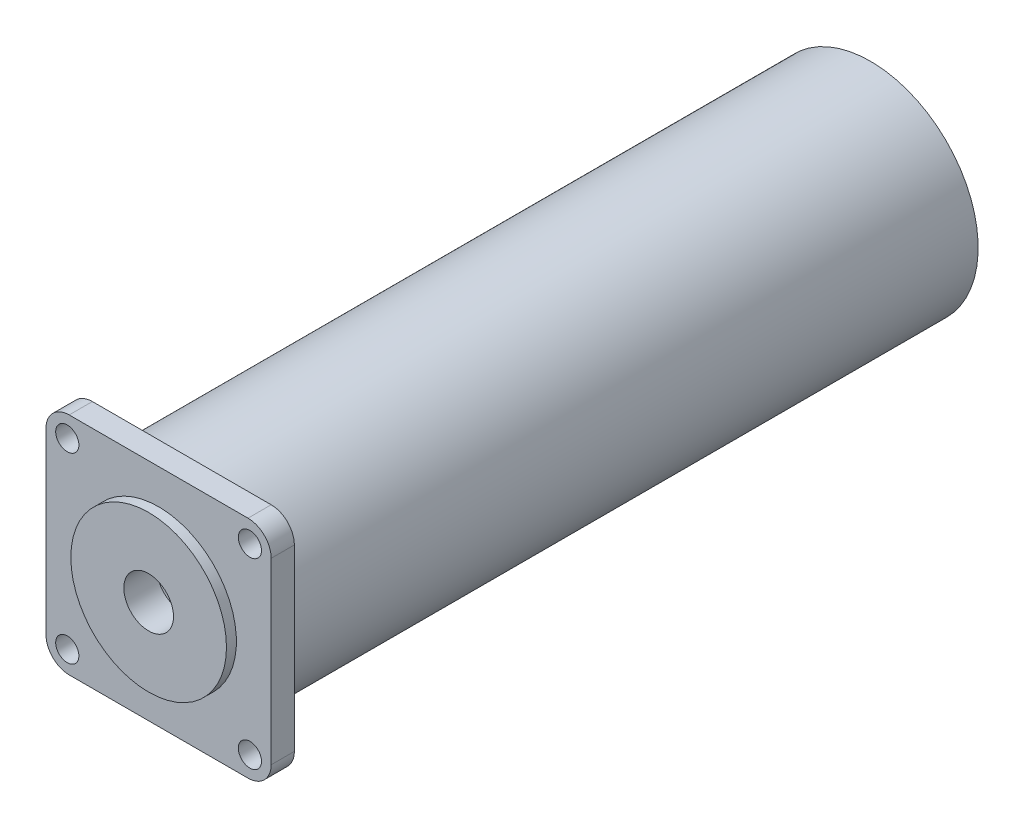
ISO-10303-21;
HEADER;
FILE_DESCRIPTION(('STEP AP214'),'2;1');
FILE_NAME('part.step','',(''),(''),'','','');
FILE_SCHEMA(('AUTOMOTIVE_DESIGN { 1 0 10303 214 1 1 1 1 }'));
ENDSEC;
DATA;
#1=APPLICATION_CONTEXT('core data for automotive mechanical design processes');
#2=APPLICATION_PROTOCOL_DEFINITION('international standard','automotive_design',2000,#1);
#3=PRODUCT_CONTEXT('',#1,'mechanical');
#4=PRODUCT('Part','Part','',(#3));
#5=PRODUCT_RELATED_PRODUCT_CATEGORY('part','',(#4));
#6=PRODUCT_DEFINITION_FORMATION('','',#4);
#7=PRODUCT_DEFINITION_CONTEXT('part definition',#1,'design');
#8=PRODUCT_DEFINITION('design','',#6,#7);
#9=PRODUCT_DEFINITION_SHAPE('','',#8);
#10=(LENGTH_UNIT() NAMED_UNIT(*) SI_UNIT(.MILLI.,.METRE.));
#11=(NAMED_UNIT(*) PLANE_ANGLE_UNIT() SI_UNIT($,.RADIAN.));
#12=(NAMED_UNIT(*) SI_UNIT($,.STERADIAN.) SOLID_ANGLE_UNIT());
#13=UNCERTAINTY_MEASURE_WITH_UNIT(LENGTH_MEASURE(1.E-05),#10,'distance_accuracy_value','');
#14=(GEOMETRIC_REPRESENTATION_CONTEXT(3) GLOBAL_UNCERTAINTY_ASSIGNED_CONTEXT((#13)) GLOBAL_UNIT_ASSIGNED_CONTEXT((#10,
#11,#12)) REPRESENTATION_CONTEXT('',''));
#15=CARTESIAN_POINT('',(0.,0.,0.));
#16=DIRECTION('',(0.,0.,1.));
#17=DIRECTION('',(1.,0.,0.));
#18=AXIS2_PLACEMENT_3D('',#15,#16,#17);
#19=CARTESIAN_POINT('',(-27.,-26.9999999999999,0.));
#20=DIRECTION('',(0.,0.,-1.));
#21=DIRECTION('',(-1.,0.,0.));
#22=AXIS2_PLACEMENT_3D('',#19,#20,#21);
#23=PLANE('',#22);
#24=CARTESIAN_POINT('',(-27.,-26.9999999999999,0.));
#25=DIRECTION('',(0.,0.,1.));
#26=DIRECTION('',(-1.,0.,0.));
#27=AXIS2_PLACEMENT_3D('',#24,#25,#26);
#28=CIRCLE('',#27,7.);
#29=CARTESIAN_POINT('',(-34.0000000000001,-26.9999999999999,0.));
#30=VERTEX_POINT('',#29);
#31=CARTESIAN_POINT('',(-27.,-33.9999999999999,0.));
#32=VERTEX_POINT('',#31);
#33=EDGE_CURVE('E147',#30,#32,#28,.T.);
#34=ORIENTED_EDGE('',*,*,#33,.T.);
#35=DIRECTION('',(1.,0.,0.));
#36=VECTOR('',#35,1.);
#37=CARTESIAN_POINT('',(-27.,-33.9999999999999,0.));
#38=LINE('',#37,#36);
#39=CARTESIAN_POINT('',(27.,-34.,0.));
#40=VERTEX_POINT('',#39);
#41=EDGE_CURVE('E151',#32,#40,#38,.T.);
#42=ORIENTED_EDGE('',*,*,#41,.T.);
#43=CARTESIAN_POINT('',(27.,-27.,0.));
#44=DIRECTION('',(0.,0.,1.));
#45=DIRECTION('',(1.,0.,0.));
#46=AXIS2_PLACEMENT_3D('',#43,#44,#45);
#47=CIRCLE('',#46,7.);
#48=CARTESIAN_POINT('',(34.,-27.,0.));
#49=VERTEX_POINT('',#48);
#50=EDGE_CURVE('E156',#40,#49,#47,.T.);
#51=ORIENTED_EDGE('',*,*,#50,.T.);
#52=DIRECTION('',(0.,1.,0.));
#53=VECTOR('',#52,1.);
#54=CARTESIAN_POINT('',(34.,-27.,0.));
#55=LINE('',#54,#53);
#56=CARTESIAN_POINT('',(34.,27.0000000000001,0.));
#57=VERTEX_POINT('',#56);
#58=EDGE_CURVE('E160',#49,#57,#55,.T.);
#59=ORIENTED_EDGE('',*,*,#58,.T.);
#60=CARTESIAN_POINT('',(27.,27.0000000000001,0.));
#61=DIRECTION('',(0.,0.,1.));
#62=DIRECTION('',(-1.,0.,0.));
#63=AXIS2_PLACEMENT_3D('',#60,#61,#62);
#64=CIRCLE('',#63,7.);
#65=CARTESIAN_POINT('',(27.,34.0000000000001,0.));
#66=VERTEX_POINT('',#65);
#67=EDGE_CURVE('E164',#57,#66,#64,.T.);
#68=ORIENTED_EDGE('',*,*,#67,.T.);
#69=DIRECTION('',(-1.,0.,0.));
#70=VECTOR('',#69,1.);
#71=CARTESIAN_POINT('',(-27.,34.0000000000002,0.));
#72=LINE('',#71,#70);
#73=CARTESIAN_POINT('',(-27.,34.0000000000002,0.));
#74=VERTEX_POINT('',#73);
#75=EDGE_CURVE('E168',#66,#74,#72,.T.);
#76=ORIENTED_EDGE('',*,*,#75,.T.);
#77=CARTESIAN_POINT('',(-27.,27.0000000000001,0.));
#78=DIRECTION('',(0.,0.,1.));
#79=DIRECTION('',(-1.,0.,0.));
#80=AXIS2_PLACEMENT_3D('',#77,#78,#79);
#81=CIRCLE('',#80,7.);
#82=CARTESIAN_POINT('',(-34.0000000000001,27.0000000000001,0.));
#83=VERTEX_POINT('',#82);
#84=EDGE_CURVE('E118',#74,#83,#81,.T.);
#85=ORIENTED_EDGE('',*,*,#84,.T.);
#86=DIRECTION('',(0.,-1.,0.));
#87=VECTOR('',#86,1.);
#88=CARTESIAN_POINT('',(-34.0000000000001,-26.9999999999999,0.));
#89=LINE('',#88,#87);
#90=EDGE_CURVE('E173',#83,#30,#89,.T.);
#91=ORIENTED_EDGE('',*,*,#90,.T.);
#92=EDGE_LOOP('',(#34,#42,#51,#59,#68,#76,#85,#91));
#93=FACE_BOUND('',#92,.T.);
#94=CARTESIAN_POINT('',(27.5771644662754,27.5771644662754,0.));
#95=DIRECTION('',(0.,0.,1.));
#96=DIRECTION('',(1.,0.,0.));
#97=AXIS2_PLACEMENT_3D('',#94,#95,#96);
#98=CIRCLE('',#97,3.5);
#99=CARTESIAN_POINT('',(31.0771644662754,27.5771644662754,0.));
#100=VERTEX_POINT('',#99);
#101=EDGE_CURVE('E298',#100,#100,#98,.T.);
#102=ORIENTED_EDGE('',*,*,#101,.F.);
#103=EDGE_LOOP('',(#102));
#104=FACE_BOUND('',#103,.T.);
#105=CARTESIAN_POINT('',(-27.5771644662754,27.5771644662755,0.));
#106=DIRECTION('',(0.,0.,1.));
#107=DIRECTION('',(1.,0.,0.));
#108=AXIS2_PLACEMENT_3D('',#105,#106,#107);
#109=CIRCLE('',#108,3.5);
#110=CARTESIAN_POINT('',(-24.0771644662754,27.5771644662755,0.));
#111=VERTEX_POINT('',#110);
#112=EDGE_CURVE('E290',#111,#111,#109,.T.);
#113=ORIENTED_EDGE('',*,*,#112,.F.);
#114=EDGE_LOOP('',(#113));
#115=FACE_BOUND('',#114,.T.);
#116=CARTESIAN_POINT('',(27.5771644662753,-27.5771644662753,0.));
#117=DIRECTION('',(0.,0.,1.));
#118=DIRECTION('',(1.,0.,0.));
#119=AXIS2_PLACEMENT_3D('',#116,#117,#118);
#120=CIRCLE('',#119,3.5);
#121=CARTESIAN_POINT('',(31.0771644662753,-27.5771644662753,0.));
#122=VERTEX_POINT('',#121);
#123=EDGE_CURVE('E282',#122,#122,#120,.T.);
#124=ORIENTED_EDGE('',*,*,#123,.F.);
#125=EDGE_LOOP('',(#124));
#126=FACE_BOUND('',#125,.T.);
#127=CARTESIAN_POINT('',(-27.5771644662754,-27.5771644662752,0.));
#128=DIRECTION('',(0.,0.,1.));
#129=DIRECTION('',(1.,0.,0.));
#130=AXIS2_PLACEMENT_3D('',#127,#128,#129);
#131=CIRCLE('',#130,3.5);
#132=CARTESIAN_POINT('',(-24.0771644662754,-27.5771644662752,0.));
#133=VERTEX_POINT('',#132);
#134=EDGE_CURVE('E274',#133,#133,#131,.T.);
#135=ORIENTED_EDGE('',*,*,#134,.F.);
#136=EDGE_LOOP('',(#135));
#137=FACE_BOUND('',#136,.T.);
#138=CARTESIAN_POINT('',(0.,0.,0.));
#139=DIRECTION('',(0.,0.,-1.));
#140=DIRECTION('',(-1.,0.,0.));
#141=AXIS2_PLACEMENT_3D('',#138,#139,#140);
#142=CIRCLE('',#141,23.5);
#143=CARTESIAN_POINT('',(-23.5,0.,0.));
#144=VERTEX_POINT('',#143);
#145=EDGE_CURVE('E11',#144,#144,#142,.F.);
#146=ORIENTED_EDGE('',*,*,#145,.F.);
#147=EDGE_LOOP('',(#146));
#148=FACE_BOUND('',#147,.T.);
#149=ADVANCED_FACE('F41',(#93,#104,#115,#126,#137,#148),#23,.F.);
#150=CARTESIAN_POINT('',(-27.,-26.9999999999999,-7.00000000000003));
#151=DIRECTION('',(0.,0.,1.));
#152=DIRECTION('',(1.,0.,0.));
#153=AXIS2_PLACEMENT_3D('',#150,#151,#152);
#154=CYLINDRICAL_SURFACE('',#153,7.);
#155=ORIENTED_EDGE('',*,*,#33,.F.);
#156=DIRECTION('',(0.,0.,1.));
#157=VECTOR('',#156,1.);
#158=CARTESIAN_POINT('',(-34.,-26.9999999999999,-7.00000000000003));
#159=LINE('',#158,#157);
#160=CARTESIAN_POINT('',(-34.,-26.9999999999999,-7.00000000000003));
#161=VERTEX_POINT('',#160);
#162=EDGE_CURVE('E51',#161,#30,#159,.T.);
#163=ORIENTED_EDGE('',*,*,#162,.F.);
#164=CARTESIAN_POINT('',(-27.,-26.9999999999999,-7.00000000000003));
#165=DIRECTION('',(0.,0.,1.));
#166=DIRECTION('',(-1.,0.,0.));
#167=AXIS2_PLACEMENT_3D('',#164,#165,#166);
#168=CIRCLE('',#167,7.);
#169=CARTESIAN_POINT('',(-27.,-33.9999999999999,-7.00000000000003));
#170=VERTEX_POINT('',#169);
#171=EDGE_CURVE('E177',#161,#170,#168,.T.);
#172=ORIENTED_EDGE('',*,*,#171,.T.);
#173=DIRECTION('',(0.,0.,1.));
#174=VECTOR('',#173,1.);
#175=CARTESIAN_POINT('',(-27.,-33.9999999999999,-7.00000000000003));
#176=LINE('',#175,#174);
#177=EDGE_CURVE('E99',#170,#32,#176,.T.);
#178=ORIENTED_EDGE('',*,*,#177,.T.);
#179=EDGE_LOOP('',(#155,#163,#172,#178));
#180=FACE_BOUND('',#179,.T.);
#181=ADVANCED_FACE('F43',(#180),#154,.T.);
#182=CARTESIAN_POINT('',(-34.,-26.9999999999999,-7.00000000000003));
#183=DIRECTION('',(-1.,0.,0.));
#184=DIRECTION('',(0.,0.,1.));
#185=AXIS2_PLACEMENT_3D('',#182,#183,#184);
#186=PLANE('',#185);
#187=ORIENTED_EDGE('',*,*,#90,.F.);
#188=DIRECTION('',(0.,0.,1.));
#189=VECTOR('',#188,1.);
#190=CARTESIAN_POINT('',(-34.,27.0000000000002,-7.00000000000003));
#191=LINE('',#190,#189);
#192=CARTESIAN_POINT('',(-34.,27.0000000000002,-7.00000000000003));
#193=VERTEX_POINT('',#192);
#194=EDGE_CURVE('E87',#193,#83,#191,.T.);
#195=ORIENTED_EDGE('',*,*,#194,.F.);
#196=DIRECTION('',(0.,-1.,0.));
#197=VECTOR('',#196,1.);
#198=CARTESIAN_POINT('',(-34.,-26.9999999999999,-7.00000000000003));
#199=LINE('',#198,#197);
#200=EDGE_CURVE('E132',#193,#161,#199,.T.);
#201=ORIENTED_EDGE('',*,*,#200,.T.);
#202=ORIENTED_EDGE('',*,*,#162,.T.);
#203=EDGE_LOOP('',(#187,#195,#201,#202));
#204=FACE_BOUND('',#203,.T.);
#205=ADVANCED_FACE('F198',(#204),#186,.T.);
#206=CARTESIAN_POINT('',(-27.,27.0000000000001,-7.00000000000003));
#207=DIRECTION('',(0.,0.,1.));
#208=DIRECTION('',(1.,0.,0.));
#209=AXIS2_PLACEMENT_3D('',#206,#207,#208);
#210=CYLINDRICAL_SURFACE('',#209,7.);
#211=ORIENTED_EDGE('',*,*,#84,.F.);
#212=DIRECTION('',(0.,0.,1.));
#213=VECTOR('',#212,1.);
#214=CARTESIAN_POINT('',(-27.,34.0000000000001,-6.99999999999998));
#215=LINE('',#214,#213);
#216=CARTESIAN_POINT('',(-27.,34.0000000000001,-6.99999999999998));
#217=VERTEX_POINT('',#216);
#218=EDGE_CURVE('E113',#217,#74,#215,.T.);
#219=ORIENTED_EDGE('',*,*,#218,.F.);
#220=CARTESIAN_POINT('',(-27.,27.0000000000001,-7.00000000000003));
#221=DIRECTION('',(0.,0.,1.));
#222=DIRECTION('',(-1.,0.,0.));
#223=AXIS2_PLACEMENT_3D('',#220,#221,#222);
#224=CIRCLE('',#223,7.);
#225=EDGE_CURVE('E116',#217,#193,#224,.T.);
#226=ORIENTED_EDGE('',*,*,#225,.T.);
#227=ORIENTED_EDGE('',*,*,#194,.T.);
#228=EDGE_LOOP('',(#211,#219,#226,#227));
#229=FACE_BOUND('',#228,.T.);
#230=ADVANCED_FACE('F115',(#229),#210,.T.);
#231=CARTESIAN_POINT('',(-27.,34.0000000000001,-6.99999999999998));
#232=DIRECTION('',(0.,1.,0.));
#233=DIRECTION('',(0.,0.,1.));
#234=AXIS2_PLACEMENT_3D('',#231,#232,#233);
#235=PLANE('',#234);
#236=ORIENTED_EDGE('',*,*,#75,.F.);
#237=DIRECTION('',(0.,0.,1.));
#238=VECTOR('',#237,1.);
#239=CARTESIAN_POINT('',(27.,34.0000000000001,-7.00000000000006));
#240=LINE('',#239,#238);
#241=CARTESIAN_POINT('',(27.,34.0000000000001,-7.00000000000006));
#242=VERTEX_POINT('',#241);
#243=EDGE_CURVE('E124',#242,#66,#240,.T.);
#244=ORIENTED_EDGE('',*,*,#243,.F.);
#245=DIRECTION('',(-1.,0.,0.));
#246=VECTOR('',#245,1.);
#247=CARTESIAN_POINT('',(-27.,34.0000000000001,-6.99999999999998));
#248=LINE('',#247,#246);
#249=EDGE_CURVE('E130',#242,#217,#248,.T.);
#250=ORIENTED_EDGE('',*,*,#249,.T.);
#251=ORIENTED_EDGE('',*,*,#218,.T.);
#252=EDGE_LOOP('',(#236,#244,#250,#251));
#253=FACE_BOUND('',#252,.T.);
#254=ADVANCED_FACE('F135',(#253),#235,.T.);
#255=CARTESIAN_POINT('',(27.,27.,-7.00000000000006));
#256=DIRECTION('',(0.,0.,1.));
#257=DIRECTION('',(1.,0.,0.));
#258=AXIS2_PLACEMENT_3D('',#255,#256,#257);
#259=CYLINDRICAL_SURFACE('',#258,7.);
#260=ORIENTED_EDGE('',*,*,#67,.F.);
#261=DIRECTION('',(0.,0.,1.));
#262=VECTOR('',#261,1.);
#263=CARTESIAN_POINT('',(34.,27.,-7.00000000000003));
#264=LINE('',#263,#262);
#265=CARTESIAN_POINT('',(34.,27.,-7.00000000000003));
#266=VERTEX_POINT('',#265);
#267=EDGE_CURVE('E184',#266,#57,#264,.T.);
#268=ORIENTED_EDGE('',*,*,#267,.F.);
#269=CARTESIAN_POINT('',(27.,27.,-7.00000000000006));
#270=DIRECTION('',(0.,0.,1.));
#271=DIRECTION('',(-1.,0.,0.));
#272=AXIS2_PLACEMENT_3D('',#269,#270,#271);
#273=CIRCLE('',#272,7.);
#274=EDGE_CURVE('E137',#266,#242,#273,.T.);
#275=ORIENTED_EDGE('',*,*,#274,.T.);
#276=ORIENTED_EDGE('',*,*,#243,.T.);
#277=EDGE_LOOP('',(#260,#268,#275,#276));
#278=FACE_BOUND('',#277,.T.);
#279=ADVANCED_FACE('F332',(#278),#259,.T.);
#280=CARTESIAN_POINT('',(34.,-27.,-6.99999999999997));
#281=DIRECTION('',(1.,0.,0.));
#282=DIRECTION('',(0.,0.,-1.));
#283=AXIS2_PLACEMENT_3D('',#280,#281,#282);
#284=PLANE('',#283);
#285=ORIENTED_EDGE('',*,*,#58,.F.);
#286=DIRECTION('',(0.,0.,1.));
#287=VECTOR('',#286,1.);
#288=CARTESIAN_POINT('',(34.,-27.,-6.99999999999997));
#289=LINE('',#288,#287);
#290=CARTESIAN_POINT('',(34.,-27.,-6.99999999999997));
#291=VERTEX_POINT('',#290);
#292=EDGE_CURVE('E187',#291,#49,#289,.T.);
#293=ORIENTED_EDGE('',*,*,#292,.F.);
#294=DIRECTION('',(0.,1.,0.));
#295=VECTOR('',#294,1.);
#296=CARTESIAN_POINT('',(34.,-27.,-6.99999999999997));
#297=LINE('',#296,#295);
#298=EDGE_CURVE('E141',#291,#266,#297,.T.);
#299=ORIENTED_EDGE('',*,*,#298,.T.);
#300=ORIENTED_EDGE('',*,*,#267,.T.);
#301=EDGE_LOOP('',(#285,#293,#299,#300));
#302=FACE_BOUND('',#301,.T.);
#303=ADVANCED_FACE('F326',(#302),#284,.T.);
#304=CARTESIAN_POINT('',(27.,-27.,-7.00000000000001));
#305=DIRECTION('',(0.,0.,1.));
#306=DIRECTION('',(1.,0.,0.));
#307=AXIS2_PLACEMENT_3D('',#304,#305,#306);
#308=CYLINDRICAL_SURFACE('',#307,7.);
#309=ORIENTED_EDGE('',*,*,#50,.F.);
#310=DIRECTION('',(0.,0.,1.));
#311=VECTOR('',#310,1.);
#312=CARTESIAN_POINT('',(27.,-34.,-7.));
#313=LINE('',#312,#311);
#314=CARTESIAN_POINT('',(27.,-34.,-7.));
#315=VERTEX_POINT('',#314);
#316=EDGE_CURVE('E190',#315,#40,#313,.T.);
#317=ORIENTED_EDGE('',*,*,#316,.F.);
#318=CARTESIAN_POINT('',(27.,-27.,-7.00000000000001));
#319=DIRECTION('',(0.,0.,1.));
#320=DIRECTION('',(1.,0.,0.));
#321=AXIS2_PLACEMENT_3D('',#318,#319,#320);
#322=CIRCLE('',#321,7.);
#323=EDGE_CURVE('E317',#315,#291,#322,.T.);
#324=ORIENTED_EDGE('',*,*,#323,.T.);
#325=ORIENTED_EDGE('',*,*,#292,.T.);
#326=EDGE_LOOP('',(#309,#317,#324,#325));
#327=FACE_BOUND('',#326,.T.);
#328=ADVANCED_FACE('F330',(#327),#308,.T.);
#329=CARTESIAN_POINT('',(-27.,-33.9999999999999,-7.00000000000003));
#330=DIRECTION('',(0.,-1.,0.));
#331=DIRECTION('',(0.,0.,-1.));
#332=AXIS2_PLACEMENT_3D('',#329,#330,#331);
#333=PLANE('',#332);
#334=ORIENTED_EDGE('',*,*,#41,.F.);
#335=ORIENTED_EDGE('',*,*,#177,.F.);
#336=DIRECTION('',(1.,0.,0.));
#337=VECTOR('',#336,1.);
#338=CARTESIAN_POINT('',(-27.,-33.9999999999999,-7.00000000000003));
#339=LINE('',#338,#337);
#340=EDGE_CURVE('E314',#170,#315,#339,.T.);
#341=ORIENTED_EDGE('',*,*,#340,.T.);
#342=ORIENTED_EDGE('',*,*,#316,.T.);
#343=EDGE_LOOP('',(#334,#335,#341,#342));
#344=FACE_BOUND('',#343,.T.);
#345=ADVANCED_FACE('F194',(#344),#333,.T.);
#346=CARTESIAN_POINT('',(-27.,-26.9999999999999,-7.00000000000003));
#347=DIRECTION('',(0.,0.,-1.));
#348=DIRECTION('',(-1.,0.,0.));
#349=AXIS2_PLACEMENT_3D('',#346,#347,#348);
#350=PLANE('',#349);
#351=CARTESIAN_POINT('',(0.,0.,-7.));
#352=DIRECTION('',(0.,0.,-1.));
#353=DIRECTION('',(-1.,0.,0.));
#354=AXIS2_PLACEMENT_3D('',#351,#352,#353);
#355=CIRCLE('',#354,32.5);
#356=CARTESIAN_POINT('',(-32.5,0.,-7.00000000000001));
#357=VERTEX_POINT('',#356);
#358=EDGE_CURVE('E267',#357,#357,#355,.T.);
#359=ORIENTED_EDGE('',*,*,#358,.F.);
#360=EDGE_LOOP('',(#359));
#361=FACE_BOUND('',#360,.T.);
#362=CARTESIAN_POINT('',(-27.5771644662753,-27.5771644662752,-7.00000000000006));
#363=DIRECTION('',(0.,0.,1.));
#364=DIRECTION('',(1.,0.,0.));
#365=AXIS2_PLACEMENT_3D('',#362,#363,#364);
#366=CIRCLE('',#365,3.5);
#367=CARTESIAN_POINT('',(-24.0771644662753,-27.5771644662752,-7.00000000000006));
#368=VERTEX_POINT('',#367);
#369=EDGE_CURVE('E278',#368,#368,#366,.T.);
#370=ORIENTED_EDGE('',*,*,#369,.T.);
#371=EDGE_LOOP('',(#370));
#372=FACE_BOUND('',#371,.T.);
#373=CARTESIAN_POINT('',(27.5771644662753,-27.5771644662753,-7.00000000000003));
#374=DIRECTION('',(0.,0.,1.));
#375=DIRECTION('',(1.,0.,0.));
#376=AXIS2_PLACEMENT_3D('',#373,#374,#375);
#377=CIRCLE('',#376,3.5);
#378=CARTESIAN_POINT('',(31.0771644662754,-27.5771644662753,-7.00000000000003));
#379=VERTEX_POINT('',#378);
#380=EDGE_CURVE('E286',#379,#379,#377,.T.);
#381=ORIENTED_EDGE('',*,*,#380,.T.);
#382=EDGE_LOOP('',(#381));
#383=FACE_BOUND('',#382,.T.);
#384=CARTESIAN_POINT('',(-27.5771644662753,27.5771644662755,-7.00000000000006));
#385=DIRECTION('',(0.,0.,1.));
#386=DIRECTION('',(1.,0.,0.));
#387=AXIS2_PLACEMENT_3D('',#384,#385,#386);
#388=CIRCLE('',#387,3.5);
#389=CARTESIAN_POINT('',(-24.0771644662753,27.5771644662755,-7.00000000000005));
#390=VERTEX_POINT('',#389);
#391=EDGE_CURVE('E294',#390,#390,#388,.T.);
#392=ORIENTED_EDGE('',*,*,#391,.T.);
#393=EDGE_LOOP('',(#392));
#394=FACE_BOUND('',#393,.T.);
#395=CARTESIAN_POINT('',(27.5771644662753,27.5771644662754,-7.00000000000006));
#396=DIRECTION('',(0.,0.,1.));
#397=DIRECTION('',(1.,0.,0.));
#398=AXIS2_PLACEMENT_3D('',#395,#396,#397);
#399=CIRCLE('',#398,3.5);
#400=CARTESIAN_POINT('',(31.0771644662754,27.5771644662754,-7.00000000000005));
#401=VERTEX_POINT('',#400);
#402=EDGE_CURVE('E302',#401,#401,#399,.T.);
#403=ORIENTED_EDGE('',*,*,#402,.T.);
#404=EDGE_LOOP('',(#403));
#405=FACE_BOUND('',#404,.T.);
#406=ORIENTED_EDGE('',*,*,#171,.F.);
#407=ORIENTED_EDGE('',*,*,#200,.F.);
#408=ORIENTED_EDGE('',*,*,#225,.F.);
#409=ORIENTED_EDGE('',*,*,#249,.F.);
#410=ORIENTED_EDGE('',*,*,#274,.F.);
#411=ORIENTED_EDGE('',*,*,#298,.F.);
#412=ORIENTED_EDGE('',*,*,#323,.F.);
#413=ORIENTED_EDGE('',*,*,#340,.F.);
#414=EDGE_LOOP('',(#406,#407,#408,#409,#410,#411,#412,#413));
#415=FACE_BOUND('',#414,.T.);
#416=ADVANCED_FACE('F128',(#361,#372,#383,#394,#405,#415),#350,.T.);
#417=CARTESIAN_POINT('',(27.5771644662753,27.5771644662754,-7.00000000000006));
#418=DIRECTION('',(0.,0.,1.));
#419=DIRECTION('',(1.,0.,0.));
#420=AXIS2_PLACEMENT_3D('',#417,#418,#419);
#421=CYLINDRICAL_SURFACE('',#420,3.5);
#422=ORIENTED_EDGE('',*,*,#402,.F.);
#423=EDGE_LOOP('',(#422));
#424=FACE_BOUND('',#423,.T.);
#425=ORIENTED_EDGE('',*,*,#101,.T.);
#426=EDGE_LOOP('',(#425));
#427=FACE_BOUND('',#426,.T.);
#428=ADVANCED_FACE('F213',(#424,#427),#421,.F.);
#429=CARTESIAN_POINT('',(-27.5771644662753,27.5771644662755,-7.00000000000006));
#430=DIRECTION('',(0.,0.,1.));
#431=DIRECTION('',(1.,0.,0.));
#432=AXIS2_PLACEMENT_3D('',#429,#430,#431);
#433=CYLINDRICAL_SURFACE('',#432,3.5);
#434=ORIENTED_EDGE('',*,*,#391,.F.);
#435=EDGE_LOOP('',(#434));
#436=FACE_BOUND('',#435,.T.);
#437=ORIENTED_EDGE('',*,*,#112,.T.);
#438=EDGE_LOOP('',(#437));
#439=FACE_BOUND('',#438,.T.);
#440=ADVANCED_FACE('F222',(#436,#439),#433,.F.);
#441=CARTESIAN_POINT('',(27.5771644662753,-27.5771644662753,-7.00000000000003));
#442=DIRECTION('',(0.,0.,1.));
#443=DIRECTION('',(1.,0.,0.));
#444=AXIS2_PLACEMENT_3D('',#441,#442,#443);
#445=CYLINDRICAL_SURFACE('',#444,3.5);
#446=ORIENTED_EDGE('',*,*,#380,.F.);
#447=EDGE_LOOP('',(#446));
#448=FACE_BOUND('',#447,.T.);
#449=ORIENTED_EDGE('',*,*,#123,.T.);
#450=EDGE_LOOP('',(#449));
#451=FACE_BOUND('',#450,.T.);
#452=ADVANCED_FACE('F226',(#448,#451),#445,.F.);
#453=CARTESIAN_POINT('',(-27.5771644662753,-27.5771644662752,-7.00000000000006));
#454=DIRECTION('',(0.,0.,1.));
#455=DIRECTION('',(1.,0.,0.));
#456=AXIS2_PLACEMENT_3D('',#453,#454,#455);
#457=CYLINDRICAL_SURFACE('',#456,3.5);
#458=ORIENTED_EDGE('',*,*,#369,.F.);
#459=EDGE_LOOP('',(#458));
#460=FACE_BOUND('',#459,.T.);
#461=ORIENTED_EDGE('',*,*,#134,.T.);
#462=EDGE_LOOP('',(#461));
#463=FACE_BOUND('',#462,.T.);
#464=ADVANCED_FACE('F230',(#460,#463),#457,.F.);
#465=CARTESIAN_POINT('',(0.,0.,-215.));
#466=DIRECTION('',(0.,0.,1.));
#467=DIRECTION('',(1.,0.,0.));
#468=AXIS2_PLACEMENT_3D('',#465,#466,#467);
#469=CYLINDRICAL_SURFACE('',#468,32.5);
#470=CARTESIAN_POINT('',(0.,0.,-215.));
#471=DIRECTION('',(0.,0.,-1.));
#472=DIRECTION('',(-1.,0.,0.));
#473=AXIS2_PLACEMENT_3D('',#470,#471,#472);
#474=CIRCLE('',#473,32.5);
#475=CARTESIAN_POINT('',(-32.5000000000001,0.,-215.));
#476=VERTEX_POINT('',#475);
#477=EDGE_CURVE('E270',#476,#476,#474,.T.);
#478=ORIENTED_EDGE('',*,*,#477,.F.);
#479=EDGE_LOOP('',(#478));
#480=FACE_BOUND('',#479,.T.);
#481=ORIENTED_EDGE('',*,*,#358,.T.);
#482=EDGE_LOOP('',(#481));
#483=FACE_BOUND('',#482,.T.);
#484=ADVANCED_FACE('F234',(#480,#483),#469,.T.);
#485=CARTESIAN_POINT('',(0.,0.,-215.));
#486=DIRECTION('',(0.,0.,-1.));
#487=DIRECTION('',(-1.,0.,0.));
#488=AXIS2_PLACEMENT_3D('',#485,#486,#487);
#489=PLANE('',#488);
#490=ORIENTED_EDGE('',*,*,#477,.T.);
#491=EDGE_LOOP('',(#490));
#492=FACE_BOUND('',#491,.T.);
#493=ADVANCED_FACE('F238',(#492),#489,.T.);
#494=CARTESIAN_POINT('',(0.,0.,3.00000000000001));
#495=DIRECTION('',(0.,0.,1.));
#496=DIRECTION('',(1.,0.,0.));
#497=AXIS2_PLACEMENT_3D('',#494,#495,#496);
#498=PLANE('',#497);
#499=CARTESIAN_POINT('',(0.,0.,3.00000000000001));
#500=DIRECTION('',(0.,0.,1.));
#501=DIRECTION('',(1.,0.,0.));
#502=AXIS2_PLACEMENT_3D('',#499,#500,#501);
#503=CIRCLE('',#502,23.5);
#504=CARTESIAN_POINT('',(23.5,0.,3.00000000000002));
#505=VERTEX_POINT('',#504);
#506=EDGE_CURVE('E258',#505,#505,#503,.T.);
#507=ORIENTED_EDGE('',*,*,#506,.T.);
#508=EDGE_LOOP('',(#507));
#509=FACE_BOUND('',#508,.T.);
#510=CARTESIAN_POINT('',(0.,0.,3.00000000000001));
#511=DIRECTION('',(0.,0.,1.));
#512=DIRECTION('',(1.,0.,0.));
#513=AXIS2_PLACEMENT_3D('',#510,#511,#512);
#514=CIRCLE('',#513,7.5);
#515=CARTESIAN_POINT('',(7.49999999999996,0.,3.00000000000001));
#516=VERTEX_POINT('',#515);
#517=EDGE_CURVE('E261',#516,#516,#514,.T.);
#518=ORIENTED_EDGE('',*,*,#517,.F.);
#519=EDGE_LOOP('',(#518));
#520=FACE_BOUND('',#519,.T.);
#521=ADVANCED_FACE('F246',(#509,#520),#498,.T.);
#522=CARTESIAN_POINT('',(0.,0.,3.00000000000001));
#523=DIRECTION('',(0.,0.,-1.));
#524=DIRECTION('',(-1.,0.,0.));
#525=AXIS2_PLACEMENT_3D('',#522,#523,#524);
#526=CYLINDRICAL_SURFACE('',#525,23.5);
#527=ORIENTED_EDGE('',*,*,#506,.F.);
#528=EDGE_LOOP('',(#527));
#529=FACE_BOUND('',#528,.T.);
#530=ORIENTED_EDGE('',*,*,#145,.T.);
#531=EDGE_LOOP('',(#530));
#532=FACE_BOUND('',#531,.T.);
#533=ADVANCED_FACE('F242',(#529,#532),#526,.T.);
#534=CARTESIAN_POINT('',(0.,0.,-7.));
#535=DIRECTION('',(0.,0.,-1.));
#536=DIRECTION('',(-1.,0.,0.));
#537=AXIS2_PLACEMENT_3D('',#534,#535,#536);
#538=PLANE('',#537);
#539=CARTESIAN_POINT('',(0.,0.,-7.));
#540=DIRECTION('',(0.,0.,1.));
#541=DIRECTION('',(1.,0.,0.));
#542=AXIS2_PLACEMENT_3D('',#539,#540,#541);
#543=CIRCLE('',#542,7.5);
#544=CARTESIAN_POINT('',(7.50000000000001,0.,-7.));
#545=VERTEX_POINT('',#544);
#546=EDGE_CURVE('E152',#545,#545,#543,.T.);
#547=ORIENTED_EDGE('',*,*,#546,.T.);
#548=EDGE_LOOP('',(#547));
#549=FACE_BOUND('',#548,.T.);
#550=ADVANCED_FACE('F218',(#549),#538,.F.);
#551=CARTESIAN_POINT('',(0.,0.,-7.));
#552=DIRECTION('',(0.,0.,1.));
#553=DIRECTION('',(1.,0.,0.));
#554=AXIS2_PLACEMENT_3D('',#551,#552,#553);
#555=CYLINDRICAL_SURFACE('',#554,7.5);
#556=ORIENTED_EDGE('',*,*,#546,.F.);
#557=EDGE_LOOP('',(#556));
#558=FACE_BOUND('',#557,.T.);
#559=ORIENTED_EDGE('',*,*,#517,.T.);
#560=EDGE_LOOP('',(#559));
#561=FACE_BOUND('',#560,.T.);
#562=ADVANCED_FACE('F215',(#558,#561),#555,.F.);
#563=CLOSED_SHELL('',(#149,#181,#205,#230,#254,#279,#303,#328,#345,#416,#428,#440,#452,#464,
#484,#493,#521,#533,#550,#562));
#564=MANIFOLD_SOLID_BREP('B2',#563);
#565=ADVANCED_BREP_SHAPE_REPRESENTATION('',(#18,#564),#14);
#566=SHAPE_DEFINITION_REPRESENTATION(#9,#565);
ENDSEC;
END-ISO-10303-21;
